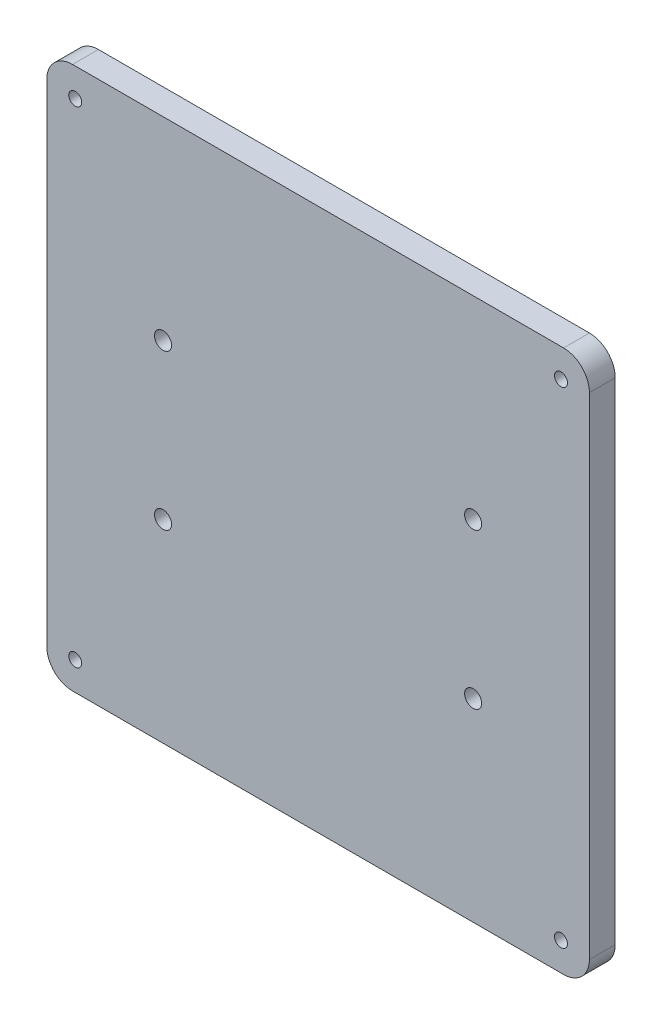
ISO-10303-21;
HEADER;
FILE_DESCRIPTION(('STEP AP214'),'2;1');
FILE_NAME('part.step','',(''),(''),'','','');
FILE_SCHEMA(('AUTOMOTIVE_DESIGN { 1 0 10303 214 1 1 1 1 }'));
ENDSEC;
DATA;
#1=APPLICATION_CONTEXT('core data for automotive mechanical design processes');
#2=APPLICATION_PROTOCOL_DEFINITION('international standard','automotive_design',2000,#1);
#3=PRODUCT_CONTEXT('',#1,'mechanical');
#4=PRODUCT('Part','Part','',(#3));
#5=PRODUCT_RELATED_PRODUCT_CATEGORY('part','',(#4));
#6=PRODUCT_DEFINITION_FORMATION('','',#4);
#7=PRODUCT_DEFINITION_CONTEXT('part definition',#1,'design');
#8=PRODUCT_DEFINITION('design','',#6,#7);
#9=PRODUCT_DEFINITION_SHAPE('','',#8);
#10=(LENGTH_UNIT() NAMED_UNIT(*) SI_UNIT(.MILLI.,.METRE.));
#11=(NAMED_UNIT(*) PLANE_ANGLE_UNIT() SI_UNIT($,.RADIAN.));
#12=(NAMED_UNIT(*) SI_UNIT($,.STERADIAN.) SOLID_ANGLE_UNIT());
#13=UNCERTAINTY_MEASURE_WITH_UNIT(LENGTH_MEASURE(1.E-05),#10,'distance_accuracy_value','');
#14=(GEOMETRIC_REPRESENTATION_CONTEXT(3) GLOBAL_UNCERTAINTY_ASSIGNED_CONTEXT((#13)) GLOBAL_UNIT_ASSIGNED_CONTEXT((#10,
#11,#12)) REPRESENTATION_CONTEXT('',''));
#15=CARTESIAN_POINT('',(0.,0.,0.));
#16=DIRECTION('',(0.,0.,1.));
#17=DIRECTION('',(1.,0.,0.));
#18=AXIS2_PLACEMENT_3D('',#15,#16,#17);
#19=CARTESIAN_POINT('',(0.,0.,5.));
#20=DIRECTION('',(0.,0.,-1.));
#21=DIRECTION('',(-1.,0.,0.));
#22=AXIS2_PLACEMENT_3D('',#19,#20,#21);
#23=PLANE('',#22);
#24=DIRECTION('',(-1.,0.,0.));
#25=VECTOR('',#24,1.);
#26=CARTESIAN_POINT('',(0.,105.,5.));
#27=LINE('',#26,#25);
#28=CARTESIAN_POINT('',(100.,105.,5.));
#29=VERTEX_POINT('',#28);
#30=CARTESIAN_POINT('',(5.,105.,5.));
#31=VERTEX_POINT('',#30);
#32=EDGE_CURVE('E136',#29,#31,#27,.T.);
#33=ORIENTED_EDGE('',*,*,#32,.T.);
#34=CARTESIAN_POINT('',(5.,100.,5.));
#35=DIRECTION('',(0.,0.,-1.));
#36=DIRECTION('',(-1.,0.,0.));
#37=AXIS2_PLACEMENT_3D('',#34,#35,#36);
#38=CIRCLE('',#37,5.);
#39=CARTESIAN_POINT('',(0.,100.,5.));
#40=VERTEX_POINT('',#39);
#41=EDGE_CURVE('E155',#31,#40,#38,.F.);
#42=ORIENTED_EDGE('',*,*,#41,.T.);
#43=DIRECTION('',(0.,-1.,0.));
#44=VECTOR('',#43,1.);
#45=CARTESIAN_POINT('',(0.,0.,5.));
#46=LINE('',#45,#44);
#47=CARTESIAN_POINT('',(0.,5.,5.));
#48=VERTEX_POINT('',#47);
#49=EDGE_CURVE('E119',#40,#48,#46,.T.);
#50=ORIENTED_EDGE('',*,*,#49,.T.);
#51=CARTESIAN_POINT('',(5.,5.,5.));
#52=DIRECTION('',(0.,0.,-1.));
#53=DIRECTION('',(-1.,0.,0.));
#54=AXIS2_PLACEMENT_3D('',#51,#52,#53);
#55=CIRCLE('',#54,5.);
#56=CARTESIAN_POINT('',(5.,0.,5.));
#57=VERTEX_POINT('',#56);
#58=EDGE_CURVE('E150',#48,#57,#55,.F.);
#59=ORIENTED_EDGE('',*,*,#58,.T.);
#60=DIRECTION('',(1.,0.,0.));
#61=VECTOR('',#60,1.);
#62=CARTESIAN_POINT('',(0.,0.,5.));
#63=LINE('',#62,#61);
#64=CARTESIAN_POINT('',(100.,0.,5.));
#65=VERTEX_POINT('',#64);
#66=EDGE_CURVE('E166',#57,#65,#63,.T.);
#67=ORIENTED_EDGE('',*,*,#66,.T.);
#68=CARTESIAN_POINT('',(100.,4.99999999999999,5.));
#69=DIRECTION('',(0.,0.,-1.));
#70=DIRECTION('',(-1.,0.,0.));
#71=AXIS2_PLACEMENT_3D('',#68,#69,#70);
#72=CIRCLE('',#71,5.);
#73=CARTESIAN_POINT('',(105.,4.99999999999999,5.));
#74=VERTEX_POINT('',#73);
#75=EDGE_CURVE('E55',#65,#74,#72,.F.);
#76=ORIENTED_EDGE('',*,*,#75,.T.);
#77=DIRECTION('',(0.,1.,0.));
#78=VECTOR('',#77,1.);
#79=CARTESIAN_POINT('',(105.,0.,5.));
#80=LINE('',#79,#78);
#81=CARTESIAN_POINT('',(105.,100.,5.));
#82=VERTEX_POINT('',#81);
#83=EDGE_CURVE('E174',#74,#82,#80,.T.);
#84=ORIENTED_EDGE('',*,*,#83,.T.);
#85=CARTESIAN_POINT('',(100.,100.,5.));
#86=DIRECTION('',(0.,0.,-1.));
#87=DIRECTION('',(-1.,0.,0.));
#88=AXIS2_PLACEMENT_3D('',#85,#86,#87);
#89=CIRCLE('',#88,5.);
#90=EDGE_CURVE('E153',#82,#29,#89,.F.);
#91=ORIENTED_EDGE('',*,*,#90,.T.);
#92=EDGE_LOOP('',(#33,#42,#50,#59,#67,#76,#84,#91));
#93=FACE_BOUND('',#92,.T.);
#94=CARTESIAN_POINT('',(5.5,5.50000000000001,5.));
#95=DIRECTION('',(0.,0.,1.));
#96=DIRECTION('',(1.,0.,0.));
#97=AXIS2_PLACEMENT_3D('',#94,#95,#96);
#98=CIRCLE('',#97,1.25);
#99=CARTESIAN_POINT('',(6.75,5.50000000000001,5.));
#100=VERTEX_POINT('',#99);
#101=EDGE_CURVE('E127',#100,#100,#98,.T.);
#102=ORIENTED_EDGE('',*,*,#101,.F.);
#103=EDGE_LOOP('',(#102));
#104=FACE_BOUND('',#103,.T.);
#105=CARTESIAN_POINT('',(99.5,5.50000000000001,5.));
#106=DIRECTION('',(0.,0.,1.));
#107=DIRECTION('',(-1.,0.,0.));
#108=AXIS2_PLACEMENT_3D('',#105,#106,#107);
#109=CIRCLE('',#108,1.25);
#110=CARTESIAN_POINT('',(98.25,5.50000000000001,5.));
#111=VERTEX_POINT('',#110);
#112=EDGE_CURVE('E181',#111,#111,#109,.T.);
#113=ORIENTED_EDGE('',*,*,#112,.F.);
#114=EDGE_LOOP('',(#113));
#115=FACE_BOUND('',#114,.T.);
#116=CARTESIAN_POINT('',(99.5,99.5,5.));
#117=DIRECTION('',(0.,0.,1.));
#118=DIRECTION('',(1.,0.,0.));
#119=AXIS2_PLACEMENT_3D('',#116,#117,#118);
#120=CIRCLE('',#119,1.25);
#121=CARTESIAN_POINT('',(100.75,99.5,5.));
#122=VERTEX_POINT('',#121);
#123=EDGE_CURVE('E186',#122,#122,#120,.T.);
#124=ORIENTED_EDGE('',*,*,#123,.F.);
#125=EDGE_LOOP('',(#124));
#126=FACE_BOUND('',#125,.T.);
#127=CARTESIAN_POINT('',(5.49999999999999,99.5,5.));
#128=DIRECTION('',(0.,0.,1.));
#129=DIRECTION('',(-1.,0.,0.));
#130=AXIS2_PLACEMENT_3D('',#127,#128,#129);
#131=CIRCLE('',#130,1.25);
#132=CARTESIAN_POINT('',(4.24999999999999,99.5,5.));
#133=VERTEX_POINT('',#132);
#134=EDGE_CURVE('E192',#133,#133,#131,.T.);
#135=ORIENTED_EDGE('',*,*,#134,.F.);
#136=EDGE_LOOP('',(#135));
#137=FACE_BOUND('',#136,.T.);
#138=CARTESIAN_POINT('',(22.5,67.5,5.));
#139=DIRECTION('',(0.,0.,1.));
#140=DIRECTION('',(1.,0.,0.));
#141=AXIS2_PLACEMENT_3D('',#138,#139,#140);
#142=CIRCLE('',#141,1.65);
#143=CARTESIAN_POINT('',(24.15,67.5,5.));
#144=VERTEX_POINT('',#143);
#145=EDGE_CURVE('E198',#144,#144,#142,.T.);
#146=ORIENTED_EDGE('',*,*,#145,.F.);
#147=EDGE_LOOP('',(#146));
#148=FACE_BOUND('',#147,.T.);
#149=CARTESIAN_POINT('',(22.5,37.5,5.));
#150=DIRECTION('',(0.,0.,1.));
#151=DIRECTION('',(-1.,0.,0.));
#152=AXIS2_PLACEMENT_3D('',#149,#150,#151);
#153=CIRCLE('',#152,1.65);
#154=CARTESIAN_POINT('',(20.85,37.5,5.));
#155=VERTEX_POINT('',#154);
#156=EDGE_CURVE('E204',#155,#155,#153,.T.);
#157=ORIENTED_EDGE('',*,*,#156,.F.);
#158=EDGE_LOOP('',(#157));
#159=FACE_BOUND('',#158,.T.);
#160=CARTESIAN_POINT('',(82.5,37.5,5.));
#161=DIRECTION('',(0.,0.,1.));
#162=DIRECTION('',(1.,0.,0.));
#163=AXIS2_PLACEMENT_3D('',#160,#161,#162);
#164=CIRCLE('',#163,1.64999999999999);
#165=CARTESIAN_POINT('',(84.15,37.5,5.));
#166=VERTEX_POINT('',#165);
#167=EDGE_CURVE('E210',#166,#166,#164,.T.);
#168=ORIENTED_EDGE('',*,*,#167,.F.);
#169=EDGE_LOOP('',(#168));
#170=FACE_BOUND('',#169,.T.);
#171=CARTESIAN_POINT('',(82.5,67.5,5.));
#172=DIRECTION('',(0.,0.,1.));
#173=DIRECTION('',(-1.,0.,0.));
#174=AXIS2_PLACEMENT_3D('',#171,#172,#173);
#175=CIRCLE('',#174,1.64999999999999);
#176=CARTESIAN_POINT('',(80.85,67.5,5.));
#177=VERTEX_POINT('',#176);
#178=EDGE_CURVE('E216',#177,#177,#175,.T.);
#179=ORIENTED_EDGE('',*,*,#178,.F.);
#180=EDGE_LOOP('',(#179));
#181=FACE_BOUND('',#180,.T.);
#182=ADVANCED_FACE('F33',(#93,#104,#115,#126,#137,#148,#159,#170,#181),#23,.F.);
#183=CARTESIAN_POINT('',(0.,0.,0.));
#184=DIRECTION('',(0.,0.,-1.));
#185=DIRECTION('',(-1.,0.,0.));
#186=AXIS2_PLACEMENT_3D('',#183,#184,#185);
#187=PLANE('',#186);
#188=CARTESIAN_POINT('',(82.5,37.5,0.));
#189=DIRECTION('',(0.,0.,1.));
#190=DIRECTION('',(1.,0.,0.));
#191=AXIS2_PLACEMENT_3D('',#188,#189,#190);
#192=CIRCLE('',#191,1.64999999999999);
#193=CARTESIAN_POINT('',(84.15,37.5,0.));
#194=VERTEX_POINT('',#193);
#195=EDGE_CURVE('E213',#194,#194,#192,.T.);
#196=ORIENTED_EDGE('',*,*,#195,.T.);
#197=EDGE_LOOP('',(#196));
#198=FACE_BOUND('',#197,.T.);
#199=CARTESIAN_POINT('',(22.5,67.5,0.));
#200=DIRECTION('',(0.,0.,1.));
#201=DIRECTION('',(1.,0.,0.));
#202=AXIS2_PLACEMENT_3D('',#199,#200,#201);
#203=CIRCLE('',#202,1.65);
#204=CARTESIAN_POINT('',(24.15,67.5,0.));
#205=VERTEX_POINT('',#204);
#206=EDGE_CURVE('E201',#205,#205,#203,.T.);
#207=ORIENTED_EDGE('',*,*,#206,.T.);
#208=EDGE_LOOP('',(#207));
#209=FACE_BOUND('',#208,.T.);
#210=CARTESIAN_POINT('',(99.5,99.5,0.));
#211=DIRECTION('',(0.,0.,1.));
#212=DIRECTION('',(1.,0.,0.));
#213=AXIS2_PLACEMENT_3D('',#210,#211,#212);
#214=CIRCLE('',#213,1.25);
#215=CARTESIAN_POINT('',(100.75,99.5,0.));
#216=VERTEX_POINT('',#215);
#217=EDGE_CURVE('E189',#216,#216,#214,.T.);
#218=ORIENTED_EDGE('',*,*,#217,.T.);
#219=EDGE_LOOP('',(#218));
#220=FACE_BOUND('',#219,.T.);
#221=CARTESIAN_POINT('',(5.5,5.50000000000001,0.));
#222=DIRECTION('',(0.,0.,1.));
#223=DIRECTION('',(1.,0.,0.));
#224=AXIS2_PLACEMENT_3D('',#221,#222,#223);
#225=CIRCLE('',#224,1.25);
#226=CARTESIAN_POINT('',(6.75,5.50000000000001,0.));
#227=VERTEX_POINT('',#226);
#228=EDGE_CURVE('E133',#227,#227,#225,.T.);
#229=ORIENTED_EDGE('',*,*,#228,.T.);
#230=EDGE_LOOP('',(#229));
#231=FACE_BOUND('',#230,.T.);
#232=DIRECTION('',(0.,-1.,0.));
#233=VECTOR('',#232,1.);
#234=CARTESIAN_POINT('',(0.,0.,0.));
#235=LINE('',#234,#233);
#236=CARTESIAN_POINT('',(0.,100.,0.));
#237=VERTEX_POINT('',#236);
#238=CARTESIAN_POINT('',(0.,5.,0.));
#239=VERTEX_POINT('',#238);
#240=EDGE_CURVE('E116',#237,#239,#235,.T.);
#241=ORIENTED_EDGE('',*,*,#240,.F.);
#242=CARTESIAN_POINT('',(5.,100.,0.));
#243=DIRECTION('',(0.,0.,-1.));
#244=DIRECTION('',(-1.,0.,0.));
#245=AXIS2_PLACEMENT_3D('',#242,#243,#244);
#246=CIRCLE('',#245,5.);
#247=CARTESIAN_POINT('',(5.,105.,0.));
#248=VERTEX_POINT('',#247);
#249=EDGE_CURVE('E99',#237,#248,#246,.T.);
#250=ORIENTED_EDGE('',*,*,#249,.T.);
#251=DIRECTION('',(-1.,0.,0.));
#252=VECTOR('',#251,1.);
#253=CARTESIAN_POINT('',(0.,105.,0.));
#254=LINE('',#253,#252);
#255=CARTESIAN_POINT('',(100.,105.,0.));
#256=VERTEX_POINT('',#255);
#257=EDGE_CURVE('E140',#256,#248,#254,.T.);
#258=ORIENTED_EDGE('',*,*,#257,.F.);
#259=CARTESIAN_POINT('',(100.,100.,0.));
#260=DIRECTION('',(0.,0.,-1.));
#261=DIRECTION('',(-1.,0.,0.));
#262=AXIS2_PLACEMENT_3D('',#259,#260,#261);
#263=CIRCLE('',#262,5.);
#264=CARTESIAN_POINT('',(105.,100.,0.));
#265=VERTEX_POINT('',#264);
#266=EDGE_CURVE('E110',#256,#265,#263,.T.);
#267=ORIENTED_EDGE('',*,*,#266,.T.);
#268=DIRECTION('',(0.,1.,0.));
#269=VECTOR('',#268,1.);
#270=CARTESIAN_POINT('',(105.,0.,0.));
#271=LINE('',#270,#269);
#272=CARTESIAN_POINT('',(105.,4.99999999999999,0.));
#273=VERTEX_POINT('',#272);
#274=EDGE_CURVE('E130',#273,#265,#271,.T.);
#275=ORIENTED_EDGE('',*,*,#274,.F.);
#276=CARTESIAN_POINT('',(100.,4.99999999999999,0.));
#277=DIRECTION('',(0.,0.,-1.));
#278=DIRECTION('',(-1.,0.,0.));
#279=AXIS2_PLACEMENT_3D('',#276,#277,#278);
#280=CIRCLE('',#279,5.);
#281=CARTESIAN_POINT('',(100.,0.,0.));
#282=VERTEX_POINT('',#281);
#283=EDGE_CURVE('E144',#273,#282,#280,.T.);
#284=ORIENTED_EDGE('',*,*,#283,.T.);
#285=DIRECTION('',(1.,0.,0.));
#286=VECTOR('',#285,1.);
#287=CARTESIAN_POINT('',(0.,0.,0.));
#288=LINE('',#287,#286);
#289=CARTESIAN_POINT('',(5.,0.,0.));
#290=VERTEX_POINT('',#289);
#291=EDGE_CURVE('E126',#290,#282,#288,.T.);
#292=ORIENTED_EDGE('',*,*,#291,.F.);
#293=CARTESIAN_POINT('',(5.,5.,0.));
#294=DIRECTION('',(0.,0.,-1.));
#295=DIRECTION('',(-1.,0.,0.));
#296=AXIS2_PLACEMENT_3D('',#293,#294,#295);
#297=CIRCLE('',#296,5.);
#298=EDGE_CURVE('E120',#290,#239,#297,.T.);
#299=ORIENTED_EDGE('',*,*,#298,.T.);
#300=EDGE_LOOP('',(#241,#250,#258,#267,#275,#284,#292,#299));
#301=FACE_BOUND('',#300,.T.);
#302=CARTESIAN_POINT('',(99.5,5.50000000000001,0.));
#303=DIRECTION('',(0.,0.,1.));
#304=DIRECTION('',(-1.,0.,0.));
#305=AXIS2_PLACEMENT_3D('',#302,#303,#304);
#306=CIRCLE('',#305,1.25);
#307=CARTESIAN_POINT('',(98.25,5.50000000000001,0.));
#308=VERTEX_POINT('',#307);
#309=EDGE_CURVE('E183',#308,#308,#306,.T.);
#310=ORIENTED_EDGE('',*,*,#309,.T.);
#311=EDGE_LOOP('',(#310));
#312=FACE_BOUND('',#311,.T.);
#313=CARTESIAN_POINT('',(5.49999999999999,99.5,0.));
#314=DIRECTION('',(0.,0.,1.));
#315=DIRECTION('',(-1.,0.,0.));
#316=AXIS2_PLACEMENT_3D('',#313,#314,#315);
#317=CIRCLE('',#316,1.25);
#318=CARTESIAN_POINT('',(4.24999999999999,99.5,0.));
#319=VERTEX_POINT('',#318);
#320=EDGE_CURVE('E195',#319,#319,#317,.T.);
#321=ORIENTED_EDGE('',*,*,#320,.T.);
#322=EDGE_LOOP('',(#321));
#323=FACE_BOUND('',#322,.T.);
#324=CARTESIAN_POINT('',(22.5,37.5,0.));
#325=DIRECTION('',(0.,0.,1.));
#326=DIRECTION('',(-1.,0.,0.));
#327=AXIS2_PLACEMENT_3D('',#324,#325,#326);
#328=CIRCLE('',#327,1.65);
#329=CARTESIAN_POINT('',(20.85,37.5,0.));
#330=VERTEX_POINT('',#329);
#331=EDGE_CURVE('E207',#330,#330,#328,.T.);
#332=ORIENTED_EDGE('',*,*,#331,.T.);
#333=EDGE_LOOP('',(#332));
#334=FACE_BOUND('',#333,.T.);
#335=CARTESIAN_POINT('',(82.5,67.5,0.));
#336=DIRECTION('',(0.,0.,1.));
#337=DIRECTION('',(-1.,0.,0.));
#338=AXIS2_PLACEMENT_3D('',#335,#336,#337);
#339=CIRCLE('',#338,1.64999999999999);
#340=CARTESIAN_POINT('',(80.85,67.5,0.));
#341=VERTEX_POINT('',#340);
#342=EDGE_CURVE('E219',#341,#341,#339,.T.);
#343=ORIENTED_EDGE('',*,*,#342,.T.);
#344=EDGE_LOOP('',(#343));
#345=FACE_BOUND('',#344,.T.);
#346=ADVANCED_FACE('F123',(#198,#209,#220,#231,#301,#312,#323,#334,#345),#187,.T.);
#347=CARTESIAN_POINT('',(0.,0.,5.));
#348=DIRECTION('',(1.,0.,0.));
#349=DIRECTION('',(0.,1.,0.));
#350=AXIS2_PLACEMENT_3D('',#347,#348,#349);
#351=PLANE('',#350);
#352=ORIENTED_EDGE('',*,*,#49,.F.);
#353=DIRECTION('',(0.,0.,-1.));
#354=VECTOR('',#353,1.);
#355=CARTESIAN_POINT('',(0.,100.,5.));
#356=LINE('',#355,#354);
#357=EDGE_CURVE('E103',#40,#237,#356,.T.);
#358=ORIENTED_EDGE('',*,*,#357,.T.);
#359=ORIENTED_EDGE('',*,*,#240,.T.);
#360=DIRECTION('',(0.,0.,-1.));
#361=VECTOR('',#360,1.);
#362=CARTESIAN_POINT('',(0.,5.,5.));
#363=LINE('',#362,#361);
#364=EDGE_CURVE('E121',#239,#48,#363,.F.);
#365=ORIENTED_EDGE('',*,*,#364,.T.);
#366=EDGE_LOOP('',(#352,#358,#359,#365));
#367=FACE_BOUND('',#366,.T.);
#368=ADVANCED_FACE('F115',(#367),#351,.F.);
#369=CARTESIAN_POINT('',(0.,0.,5.));
#370=DIRECTION('',(0.,1.,0.));
#371=DIRECTION('',(-1.,0.,0.));
#372=AXIS2_PLACEMENT_3D('',#369,#370,#371);
#373=PLANE('',#372);
#374=ORIENTED_EDGE('',*,*,#291,.T.);
#375=DIRECTION('',(0.,0.,-1.));
#376=VECTOR('',#375,1.);
#377=CARTESIAN_POINT('',(100.,0.,5.));
#378=LINE('',#377,#376);
#379=EDGE_CURVE('E11',#282,#65,#378,.F.);
#380=ORIENTED_EDGE('',*,*,#379,.T.);
#381=ORIENTED_EDGE('',*,*,#66,.F.);
#382=DIRECTION('',(0.,0.,-1.));
#383=VECTOR('',#382,1.);
#384=CARTESIAN_POINT('',(5.,0.,5.));
#385=LINE('',#384,#383);
#386=EDGE_CURVE('E41',#57,#290,#385,.T.);
#387=ORIENTED_EDGE('',*,*,#386,.T.);
#388=EDGE_LOOP('',(#374,#380,#381,#387));
#389=FACE_BOUND('',#388,.T.);
#390=ADVANCED_FACE('F164',(#389),#373,.F.);
#391=CARTESIAN_POINT('',(105.,0.,5.));
#392=DIRECTION('',(-1.,0.,0.));
#393=DIRECTION('',(0.,-1.,0.));
#394=AXIS2_PLACEMENT_3D('',#391,#392,#393);
#395=PLANE('',#394);
#396=ORIENTED_EDGE('',*,*,#274,.T.);
#397=DIRECTION('',(0.,0.,-1.));
#398=VECTOR('',#397,1.);
#399=CARTESIAN_POINT('',(105.,100.,5.));
#400=LINE('',#399,#398);
#401=EDGE_CURVE('E48',#265,#82,#400,.F.);
#402=ORIENTED_EDGE('',*,*,#401,.T.);
#403=ORIENTED_EDGE('',*,*,#83,.F.);
#404=DIRECTION('',(0.,0.,-1.));
#405=VECTOR('',#404,1.);
#406=CARTESIAN_POINT('',(105.,4.99999999999999,5.));
#407=LINE('',#406,#405);
#408=EDGE_CURVE('E157',#74,#273,#407,.T.);
#409=ORIENTED_EDGE('',*,*,#408,.T.);
#410=EDGE_LOOP('',(#396,#402,#403,#409));
#411=FACE_BOUND('',#410,.T.);
#412=ADVANCED_FACE('F173',(#411),#395,.F.);
#413=CARTESIAN_POINT('',(0.,105.,5.));
#414=DIRECTION('',(0.,-1.,0.));
#415=DIRECTION('',(0.,0.,-1.));
#416=AXIS2_PLACEMENT_3D('',#413,#414,#415);
#417=PLANE('',#416);
#418=ORIENTED_EDGE('',*,*,#257,.T.);
#419=DIRECTION('',(0.,0.,-1.));
#420=VECTOR('',#419,1.);
#421=CARTESIAN_POINT('',(5.,105.,5.));
#422=LINE('',#421,#420);
#423=EDGE_CURVE('E104',#248,#31,#422,.F.);
#424=ORIENTED_EDGE('',*,*,#423,.T.);
#425=ORIENTED_EDGE('',*,*,#32,.F.);
#426=DIRECTION('',(0.,0.,-1.));
#427=VECTOR('',#426,1.);
#428=CARTESIAN_POINT('',(100.,105.,5.));
#429=LINE('',#428,#427);
#430=EDGE_CURVE('E109',#29,#256,#429,.T.);
#431=ORIENTED_EDGE('',*,*,#430,.T.);
#432=EDGE_LOOP('',(#418,#424,#425,#431));
#433=FACE_BOUND('',#432,.T.);
#434=ADVANCED_FACE('F240',(#433),#417,.F.);
#435=CARTESIAN_POINT('',(5.5,5.50000000000001,5.));
#436=DIRECTION('',(0.,0.,-1.));
#437=DIRECTION('',(-1.,0.,0.));
#438=AXIS2_PLACEMENT_3D('',#435,#436,#437);
#439=CYLINDRICAL_SURFACE('',#438,1.25);
#440=ORIENTED_EDGE('',*,*,#101,.T.);
#441=EDGE_LOOP('',(#440));
#442=FACE_BOUND('',#441,.T.);
#443=ORIENTED_EDGE('',*,*,#228,.F.);
#444=EDGE_LOOP('',(#443));
#445=FACE_BOUND('',#444,.T.);
#446=ADVANCED_FACE('F237',(#442,#445),#439,.F.);
#447=CARTESIAN_POINT('',(99.5,5.50000000000001,5.));
#448=DIRECTION('',(0.,0.,-1.));
#449=DIRECTION('',(-1.,0.,0.));
#450=AXIS2_PLACEMENT_3D('',#447,#448,#449);
#451=CYLINDRICAL_SURFACE('',#450,1.25);
#452=ORIENTED_EDGE('',*,*,#112,.T.);
#453=EDGE_LOOP('',(#452));
#454=FACE_BOUND('',#453,.T.);
#455=ORIENTED_EDGE('',*,*,#309,.F.);
#456=EDGE_LOOP('',(#455));
#457=FACE_BOUND('',#456,.T.);
#458=ADVANCED_FACE('F373',(#454,#457),#451,.F.);
#459=CARTESIAN_POINT('',(99.5,99.5,5.));
#460=DIRECTION('',(0.,0.,-1.));
#461=DIRECTION('',(-1.,0.,0.));
#462=AXIS2_PLACEMENT_3D('',#459,#460,#461);
#463=CYLINDRICAL_SURFACE('',#462,1.25);
#464=ORIENTED_EDGE('',*,*,#123,.T.);
#465=EDGE_LOOP('',(#464));
#466=FACE_BOUND('',#465,.T.);
#467=ORIENTED_EDGE('',*,*,#217,.F.);
#468=EDGE_LOOP('',(#467));
#469=FACE_BOUND('',#468,.T.);
#470=ADVANCED_FACE('F363',(#466,#469),#463,.F.);
#471=CARTESIAN_POINT('',(5.49999999999999,99.5,5.));
#472=DIRECTION('',(0.,0.,-1.));
#473=DIRECTION('',(-1.,0.,0.));
#474=AXIS2_PLACEMENT_3D('',#471,#472,#473);
#475=CYLINDRICAL_SURFACE('',#474,1.25);
#476=ORIENTED_EDGE('',*,*,#134,.T.);
#477=EDGE_LOOP('',(#476));
#478=FACE_BOUND('',#477,.T.);
#479=ORIENTED_EDGE('',*,*,#320,.F.);
#480=EDGE_LOOP('',(#479));
#481=FACE_BOUND('',#480,.T.);
#482=ADVANCED_FACE('F353',(#478,#481),#475,.F.);
#483=CARTESIAN_POINT('',(22.5,67.5,5.));
#484=DIRECTION('',(0.,0.,-1.));
#485=DIRECTION('',(-1.,0.,0.));
#486=AXIS2_PLACEMENT_3D('',#483,#484,#485);
#487=CYLINDRICAL_SURFACE('',#486,1.65);
#488=ORIENTED_EDGE('',*,*,#145,.T.);
#489=EDGE_LOOP('',(#488));
#490=FACE_BOUND('',#489,.T.);
#491=ORIENTED_EDGE('',*,*,#206,.F.);
#492=EDGE_LOOP('',(#491));
#493=FACE_BOUND('',#492,.T.);
#494=ADVANCED_FACE('F343',(#490,#493),#487,.F.);
#495=CARTESIAN_POINT('',(22.5,37.5,5.));
#496=DIRECTION('',(0.,0.,-1.));
#497=DIRECTION('',(-1.,0.,0.));
#498=AXIS2_PLACEMENT_3D('',#495,#496,#497);
#499=CYLINDRICAL_SURFACE('',#498,1.65);
#500=ORIENTED_EDGE('',*,*,#156,.T.);
#501=EDGE_LOOP('',(#500));
#502=FACE_BOUND('',#501,.T.);
#503=ORIENTED_EDGE('',*,*,#331,.F.);
#504=EDGE_LOOP('',(#503));
#505=FACE_BOUND('',#504,.T.);
#506=ADVANCED_FACE('F333',(#502,#505),#499,.F.);
#507=CARTESIAN_POINT('',(82.5,37.5,5.));
#508=DIRECTION('',(0.,0.,-1.));
#509=DIRECTION('',(-1.,0.,0.));
#510=AXIS2_PLACEMENT_3D('',#507,#508,#509);
#511=CYLINDRICAL_SURFACE('',#510,1.64999999999999);
#512=ORIENTED_EDGE('',*,*,#167,.T.);
#513=EDGE_LOOP('',(#512));
#514=FACE_BOUND('',#513,.T.);
#515=ORIENTED_EDGE('',*,*,#195,.F.);
#516=EDGE_LOOP('',(#515));
#517=FACE_BOUND('',#516,.T.);
#518=ADVANCED_FACE('F324',(#514,#517),#511,.F.);
#519=CARTESIAN_POINT('',(82.5,67.5,5.));
#520=DIRECTION('',(0.,0.,-1.));
#521=DIRECTION('',(-1.,0.,0.));
#522=AXIS2_PLACEMENT_3D('',#519,#520,#521);
#523=CYLINDRICAL_SURFACE('',#522,1.64999999999999);
#524=ORIENTED_EDGE('',*,*,#178,.T.);
#525=EDGE_LOOP('',(#524));
#526=FACE_BOUND('',#525,.T.);
#527=ORIENTED_EDGE('',*,*,#342,.F.);
#528=EDGE_LOOP('',(#527));
#529=FACE_BOUND('',#528,.T.);
#530=ADVANCED_FACE('F225',(#526,#529),#523,.F.);
#531=CARTESIAN_POINT('',(5.,100.,5.));
#532=DIRECTION('',(0.,0.,-1.));
#533=DIRECTION('',(-1.,0.,0.));
#534=AXIS2_PLACEMENT_3D('',#531,#532,#533);
#535=CYLINDRICAL_SURFACE('',#534,5.);
#536=ORIENTED_EDGE('',*,*,#41,.F.);
#537=ORIENTED_EDGE('',*,*,#423,.F.);
#538=ORIENTED_EDGE('',*,*,#249,.F.);
#539=ORIENTED_EDGE('',*,*,#357,.F.);
#540=EDGE_LOOP('',(#536,#537,#538,#539));
#541=FACE_BOUND('',#540,.T.);
#542=ADVANCED_FACE('F102',(#541),#535,.T.);
#543=CARTESIAN_POINT('',(100.,100.,5.));
#544=DIRECTION('',(0.,0.,-1.));
#545=DIRECTION('',(-1.,0.,0.));
#546=AXIS2_PLACEMENT_3D('',#543,#544,#545);
#547=CYLINDRICAL_SURFACE('',#546,5.);
#548=ORIENTED_EDGE('',*,*,#90,.F.);
#549=ORIENTED_EDGE('',*,*,#401,.F.);
#550=ORIENTED_EDGE('',*,*,#266,.F.);
#551=ORIENTED_EDGE('',*,*,#430,.F.);
#552=EDGE_LOOP('',(#548,#549,#550,#551));
#553=FACE_BOUND('',#552,.T.);
#554=ADVANCED_FACE('F252',(#553),#547,.T.);
#555=CARTESIAN_POINT('',(100.,4.99999999999999,5.));
#556=DIRECTION('',(0.,0.,-1.));
#557=DIRECTION('',(-1.,0.,0.));
#558=AXIS2_PLACEMENT_3D('',#555,#556,#557);
#559=CYLINDRICAL_SURFACE('',#558,5.);
#560=ORIENTED_EDGE('',*,*,#75,.F.);
#561=ORIENTED_EDGE('',*,*,#379,.F.);
#562=ORIENTED_EDGE('',*,*,#283,.F.);
#563=ORIENTED_EDGE('',*,*,#408,.F.);
#564=EDGE_LOOP('',(#560,#561,#562,#563));
#565=FACE_BOUND('',#564,.T.);
#566=ADVANCED_FACE('F172',(#565),#559,.T.);
#567=CARTESIAN_POINT('',(5.,5.,5.));
#568=DIRECTION('',(0.,0.,-1.));
#569=DIRECTION('',(-1.,0.,0.));
#570=AXIS2_PLACEMENT_3D('',#567,#568,#569);
#571=CYLINDRICAL_SURFACE('',#570,5.);
#572=ORIENTED_EDGE('',*,*,#58,.F.);
#573=ORIENTED_EDGE('',*,*,#364,.F.);
#574=ORIENTED_EDGE('',*,*,#298,.F.);
#575=ORIENTED_EDGE('',*,*,#386,.F.);
#576=EDGE_LOOP('',(#572,#573,#574,#575));
#577=FACE_BOUND('',#576,.T.);
#578=ADVANCED_FACE('F35',(#577),#571,.T.);
#579=CLOSED_SHELL('',(#182,#346,#368,#390,#412,#434,#446,#458,#470,#482,#494,#506,#518,#530,
#542,#554,#566,#578));
#580=MANIFOLD_SOLID_BREP('B2',#579);
#581=ADVANCED_BREP_SHAPE_REPRESENTATION('',(#18,#580),#14);
#582=SHAPE_DEFINITION_REPRESENTATION(#9,#581);
ENDSEC;
END-ISO-10303-21;
